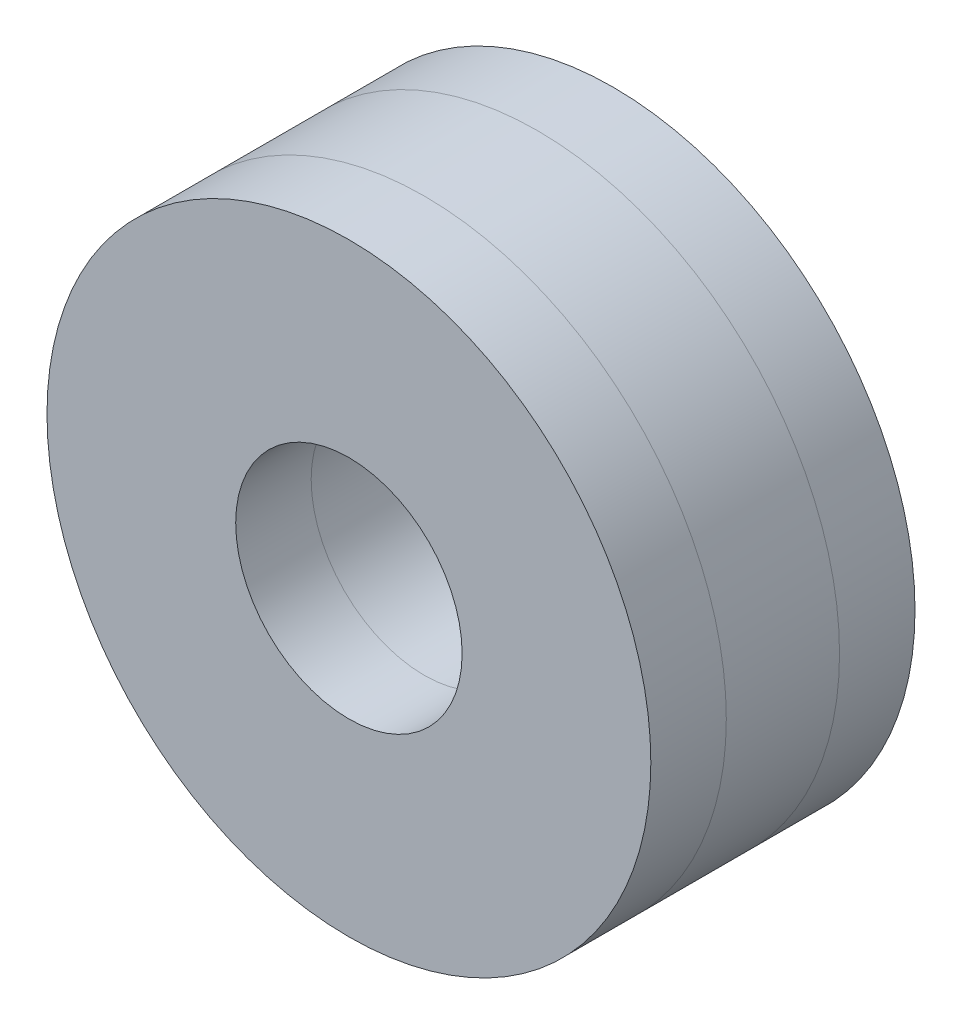
ISO-10303-21;
HEADER;
FILE_DESCRIPTION(('STEP AP214'),'2;1');
FILE_NAME('part.step','',(''),(''),'','','');
FILE_SCHEMA(('AUTOMOTIVE_DESIGN { 1 0 10303 214 1 1 1 1 }'));
ENDSEC;
DATA;
#1=APPLICATION_CONTEXT('core data for automotive mechanical design processes');
#2=APPLICATION_PROTOCOL_DEFINITION('international standard','automotive_design',2000,#1);
#3=PRODUCT_CONTEXT('',#1,'mechanical');
#4=PRODUCT('Part','Part','',(#3));
#5=PRODUCT_RELATED_PRODUCT_CATEGORY('part','',(#4));
#6=PRODUCT_DEFINITION_FORMATION('','',#4);
#7=PRODUCT_DEFINITION_CONTEXT('part definition',#1,'design');
#8=PRODUCT_DEFINITION('design','',#6,#7);
#9=PRODUCT_DEFINITION_SHAPE('','',#8);
#10=(LENGTH_UNIT() NAMED_UNIT(*) SI_UNIT(.MILLI.,.METRE.));
#11=(NAMED_UNIT(*) PLANE_ANGLE_UNIT() SI_UNIT($,.RADIAN.));
#12=(NAMED_UNIT(*) SI_UNIT($,.STERADIAN.) SOLID_ANGLE_UNIT());
#13=UNCERTAINTY_MEASURE_WITH_UNIT(LENGTH_MEASURE(1.E-05),#10,'distance_accuracy_value','');
#14=(GEOMETRIC_REPRESENTATION_CONTEXT(3) GLOBAL_UNCERTAINTY_ASSIGNED_CONTEXT((#13)) GLOBAL_UNIT_ASSIGNED_CONTEXT((#10,
#11,#12)) REPRESENTATION_CONTEXT('',''));
#15=CARTESIAN_POINT('',(0.,0.,0.));
#16=DIRECTION('',(0.,0.,1.));
#17=DIRECTION('',(1.,0.,0.));
#18=AXIS2_PLACEMENT_3D('',#15,#16,#17);
#19=CARTESIAN_POINT('',(0.,0.,3.5));
#20=DIRECTION('',(0.,0.,1.));
#21=DIRECTION('',(1.,0.,0.));
#22=AXIS2_PLACEMENT_3D('',#19,#20,#21);
#23=PLANE('',#22);
#24=CARTESIAN_POINT('',(0.,0.,3.5));
#25=DIRECTION('',(0.,0.,1.));
#26=DIRECTION('',(1.,0.,0.));
#27=AXIS2_PLACEMENT_3D('',#24,#25,#26);
#28=CIRCLE('',#27,4.);
#29=CARTESIAN_POINT('',(4.,0.,3.5));
#30=VERTEX_POINT('',#29);
#31=EDGE_CURVE('E11',#30,#30,#28,.T.);
#32=ORIENTED_EDGE('',*,*,#31,.T.);
#33=EDGE_LOOP('',(#32));
#34=FACE_BOUND('',#33,.T.);
#35=CARTESIAN_POINT('',(0.,0.,3.5));
#36=DIRECTION('',(0.,0.,1.));
#37=DIRECTION('',(1.,0.,0.));
#38=AXIS2_PLACEMENT_3D('',#35,#36,#37);
#39=CIRCLE('',#38,1.5);
#40=CARTESIAN_POINT('',(1.5,0.,3.5));
#41=VERTEX_POINT('',#40);
#42=EDGE_CURVE('E57',#41,#41,#39,.T.);
#43=ORIENTED_EDGE('',*,*,#42,.F.);
#44=EDGE_LOOP('',(#43));
#45=FACE_BOUND('',#44,.T.);
#46=ADVANCED_FACE('F46',(#34,#45),#23,.T.);
#47=CARTESIAN_POINT('',(0.,0.,2.5));
#48=DIRECTION('',(0.,0.,1.));
#49=DIRECTION('',(1.,0.,0.));
#50=AXIS2_PLACEMENT_3D('',#47,#48,#49);
#51=PLANE('',#50);
#52=CARTESIAN_POINT('',(0.,0.,2.5));
#53=DIRECTION('',(0.,0.,1.));
#54=DIRECTION('',(1.,0.,0.));
#55=AXIS2_PLACEMENT_3D('',#52,#53,#54);
#56=CIRCLE('',#55,4.);
#57=CARTESIAN_POINT('',(4.,0.,2.5));
#58=VERTEX_POINT('',#57);
#59=EDGE_CURVE('E50',#58,#58,#56,.T.);
#60=ORIENTED_EDGE('',*,*,#59,.F.);
#61=EDGE_LOOP('',(#60));
#62=FACE_BOUND('',#61,.T.);
#63=CARTESIAN_POINT('',(0.,0.,2.5));
#64=DIRECTION('',(0.,0.,1.));
#65=DIRECTION('',(1.,0.,0.));
#66=AXIS2_PLACEMENT_3D('',#63,#64,#65);
#67=CIRCLE('',#66,1.5);
#68=CARTESIAN_POINT('',(1.5,0.,2.5));
#69=VERTEX_POINT('',#68);
#70=EDGE_CURVE('E59',#69,#69,#67,.T.);
#71=ORIENTED_EDGE('',*,*,#70,.T.);
#72=EDGE_LOOP('',(#71));
#73=FACE_BOUND('',#72,.T.);
#74=ADVANCED_FACE('F69',(#62,#73),#51,.F.);
#75=CARTESIAN_POINT('',(0.,0.,3.5));
#76=DIRECTION('',(0.,0.,-1.));
#77=DIRECTION('',(-1.,0.,0.));
#78=AXIS2_PLACEMENT_3D('',#75,#76,#77);
#79=CYLINDRICAL_SURFACE('',#78,4.);
#80=ORIENTED_EDGE('',*,*,#31,.F.);
#81=EDGE_LOOP('',(#80));
#82=FACE_BOUND('',#81,.T.);
#83=ORIENTED_EDGE('',*,*,#59,.T.);
#84=EDGE_LOOP('',(#83));
#85=FACE_BOUND('',#84,.T.);
#86=ADVANCED_FACE('F48',(#82,#85),#79,.T.);
#87=CARTESIAN_POINT('',(0.,0.,3.5));
#88=DIRECTION('',(0.,0.,-1.));
#89=DIRECTION('',(-1.,0.,0.));
#90=AXIS2_PLACEMENT_3D('',#87,#88,#89);
#91=CYLINDRICAL_SURFACE('',#90,1.5);
#92=ORIENTED_EDGE('',*,*,#42,.T.);
#93=EDGE_LOOP('',(#92));
#94=FACE_BOUND('',#93,.T.);
#95=ORIENTED_EDGE('',*,*,#70,.F.);
#96=EDGE_LOOP('',(#95));
#97=FACE_BOUND('',#96,.T.);
#98=ADVANCED_FACE('F65',(#94,#97),#91,.F.);
#99=CLOSED_SHELL('',(#46,#74,#86,#98));
#100=MANIFOLD_SOLID_BREP('B2',#99);
#101=CARTESIAN_POINT('',(0.,0.,2.5));
#102=DIRECTION('',(0.,0.,1.));
#103=DIRECTION('',(1.,0.,0.));
#104=AXIS2_PLACEMENT_3D('',#101,#102,#103);
#105=PLANE('',#104);
#106=CARTESIAN_POINT('',(0.,0.,2.5));
#107=DIRECTION('',(0.,0.,1.));
#108=DIRECTION('',(1.,0.,0.));
#109=AXIS2_PLACEMENT_3D('',#106,#107,#108);
#110=CIRCLE('',#109,4.);
#111=CARTESIAN_POINT('',(4.,0.,2.5));
#112=VERTEX_POINT('',#111);
#113=EDGE_CURVE('E45',#112,#112,#110,.T.);
#114=ORIENTED_EDGE('',*,*,#113,.T.);
#115=EDGE_LOOP('',(#114));
#116=FACE_BOUND('',#115,.T.);
#117=CARTESIAN_POINT('',(0.,0.,2.5));
#118=DIRECTION('',(0.,0.,1.));
#119=DIRECTION('',(1.,0.,0.));
#120=AXIS2_PLACEMENT_3D('',#117,#118,#119);
#121=CIRCLE('',#120,1.5);
#122=CARTESIAN_POINT('',(1.5,0.,2.5));
#123=VERTEX_POINT('',#122);
#124=EDGE_CURVE('E128',#123,#123,#121,.T.);
#125=ORIENTED_EDGE('',*,*,#124,.F.);
#126=EDGE_LOOP('',(#125));
#127=FACE_BOUND('',#126,.T.);
#128=ADVANCED_FACE('F115',(#116,#127),#105,.T.);
#129=CARTESIAN_POINT('',(0.,0.,1.));
#130=DIRECTION('',(0.,0.,1.));
#131=DIRECTION('',(1.,0.,0.));
#132=AXIS2_PLACEMENT_3D('',#129,#130,#131);
#133=PLANE('',#132);
#134=CARTESIAN_POINT('',(0.,0.,1.));
#135=DIRECTION('',(0.,0.,1.));
#136=DIRECTION('',(1.,0.,0.));
#137=AXIS2_PLACEMENT_3D('',#134,#135,#136);
#138=CIRCLE('',#137,4.);
#139=CARTESIAN_POINT('',(4.,0.,1.));
#140=VERTEX_POINT('',#139);
#141=EDGE_CURVE('E119',#140,#140,#138,.T.);
#142=ORIENTED_EDGE('',*,*,#141,.F.);
#143=EDGE_LOOP('',(#142));
#144=FACE_BOUND('',#143,.T.);
#145=CARTESIAN_POINT('',(0.,0.,1.));
#146=DIRECTION('',(0.,0.,1.));
#147=DIRECTION('',(1.,0.,0.));
#148=AXIS2_PLACEMENT_3D('',#145,#146,#147);
#149=CIRCLE('',#148,1.5);
#150=CARTESIAN_POINT('',(1.5,0.,1.));
#151=VERTEX_POINT('',#150);
#152=EDGE_CURVE('E130',#151,#151,#149,.T.);
#153=ORIENTED_EDGE('',*,*,#152,.T.);
#154=EDGE_LOOP('',(#153));
#155=FACE_BOUND('',#154,.T.);
#156=ADVANCED_FACE('F142',(#144,#155),#133,.F.);
#157=CARTESIAN_POINT('',(0.,0.,2.5));
#158=DIRECTION('',(0.,0.,-1.));
#159=DIRECTION('',(-1.,0.,0.));
#160=AXIS2_PLACEMENT_3D('',#157,#158,#159);
#161=CYLINDRICAL_SURFACE('',#160,4.);
#162=ORIENTED_EDGE('',*,*,#113,.F.);
#163=EDGE_LOOP('',(#162));
#164=FACE_BOUND('',#163,.T.);
#165=ORIENTED_EDGE('',*,*,#141,.T.);
#166=EDGE_LOOP('',(#165));
#167=FACE_BOUND('',#166,.T.);
#168=ADVANCED_FACE('F117',(#164,#167),#161,.T.);
#169=CARTESIAN_POINT('',(0.,0.,2.5));
#170=DIRECTION('',(0.,0.,-1.));
#171=DIRECTION('',(-1.,0.,0.));
#172=AXIS2_PLACEMENT_3D('',#169,#170,#171);
#173=CYLINDRICAL_SURFACE('',#172,1.5);
#174=ORIENTED_EDGE('',*,*,#124,.T.);
#175=EDGE_LOOP('',(#174));
#176=FACE_BOUND('',#175,.T.);
#177=ORIENTED_EDGE('',*,*,#152,.F.);
#178=EDGE_LOOP('',(#177));
#179=FACE_BOUND('',#178,.T.);
#180=ADVANCED_FACE('F138',(#176,#179),#173,.F.);
#181=CLOSED_SHELL('',(#128,#156,#168,#180));
#182=MANIFOLD_SOLID_BREP('B6',#181);
#183=CARTESIAN_POINT('',(0.,0.,1.));
#184=DIRECTION('',(0.,0.,1.));
#185=DIRECTION('',(1.,0.,0.));
#186=AXIS2_PLACEMENT_3D('',#183,#184,#185);
#187=PLANE('',#186);
#188=CARTESIAN_POINT('',(0.,0.,1.));
#189=DIRECTION('',(0.,0.,1.));
#190=DIRECTION('',(1.,0.,0.));
#191=AXIS2_PLACEMENT_3D('',#188,#189,#190);
#192=CIRCLE('',#191,4.);
#193=CARTESIAN_POINT('',(4.,0.,1.));
#194=VERTEX_POINT('',#193);
#195=EDGE_CURVE('E114',#194,#194,#192,.T.);
#196=ORIENTED_EDGE('',*,*,#195,.T.);
#197=EDGE_LOOP('',(#196));
#198=FACE_BOUND('',#197,.T.);
#199=CARTESIAN_POINT('',(0.,0.,1.));
#200=DIRECTION('',(0.,0.,1.));
#201=DIRECTION('',(1.,0.,0.));
#202=AXIS2_PLACEMENT_3D('',#199,#200,#201);
#203=CIRCLE('',#202,1.5);
#204=CARTESIAN_POINT('',(1.5,0.,1.));
#205=VERTEX_POINT('',#204);
#206=EDGE_CURVE('E192',#205,#205,#203,.T.);
#207=ORIENTED_EDGE('',*,*,#206,.F.);
#208=EDGE_LOOP('',(#207));
#209=FACE_BOUND('',#208,.T.);
#210=ADVANCED_FACE('F181',(#198,#209),#187,.T.);
#211=CARTESIAN_POINT('',(0.,0.,0.));
#212=DIRECTION('',(0.,0.,1.));
#213=DIRECTION('',(1.,0.,0.));
#214=AXIS2_PLACEMENT_3D('',#211,#212,#213);
#215=PLANE('',#214);
#216=CARTESIAN_POINT('',(0.,0.,0.));
#217=DIRECTION('',(0.,0.,1.));
#218=DIRECTION('',(1.,0.,0.));
#219=AXIS2_PLACEMENT_3D('',#216,#217,#218);
#220=CIRCLE('',#219,4.);
#221=CARTESIAN_POINT('',(4.,0.,0.));
#222=VERTEX_POINT('',#221);
#223=EDGE_CURVE('E185',#222,#222,#220,.T.);
#224=ORIENTED_EDGE('',*,*,#223,.F.);
#225=EDGE_LOOP('',(#224));
#226=FACE_BOUND('',#225,.T.);
#227=CARTESIAN_POINT('',(0.,0.,0.));
#228=DIRECTION('',(0.,0.,1.));
#229=DIRECTION('',(1.,0.,0.));
#230=AXIS2_PLACEMENT_3D('',#227,#228,#229);
#231=CIRCLE('',#230,1.5);
#232=CARTESIAN_POINT('',(1.5,0.,0.));
#233=VERTEX_POINT('',#232);
#234=EDGE_CURVE('E194',#233,#233,#231,.T.);
#235=ORIENTED_EDGE('',*,*,#234,.T.);
#236=EDGE_LOOP('',(#235));
#237=FACE_BOUND('',#236,.T.);
#238=ADVANCED_FACE('F204',(#226,#237),#215,.F.);
#239=CARTESIAN_POINT('',(0.,0.,1.));
#240=DIRECTION('',(0.,0.,-1.));
#241=DIRECTION('',(-1.,0.,0.));
#242=AXIS2_PLACEMENT_3D('',#239,#240,#241);
#243=CYLINDRICAL_SURFACE('',#242,4.);
#244=ORIENTED_EDGE('',*,*,#195,.F.);
#245=EDGE_LOOP('',(#244));
#246=FACE_BOUND('',#245,.T.);
#247=ORIENTED_EDGE('',*,*,#223,.T.);
#248=EDGE_LOOP('',(#247));
#249=FACE_BOUND('',#248,.T.);
#250=ADVANCED_FACE('F183',(#246,#249),#243,.T.);
#251=CARTESIAN_POINT('',(0.,0.,1.));
#252=DIRECTION('',(0.,0.,-1.));
#253=DIRECTION('',(-1.,0.,0.));
#254=AXIS2_PLACEMENT_3D('',#251,#252,#253);
#255=CYLINDRICAL_SURFACE('',#254,1.5);
#256=ORIENTED_EDGE('',*,*,#206,.T.);
#257=EDGE_LOOP('',(#256));
#258=FACE_BOUND('',#257,.T.);
#259=ORIENTED_EDGE('',*,*,#234,.F.);
#260=EDGE_LOOP('',(#259));
#261=FACE_BOUND('',#260,.T.);
#262=ADVANCED_FACE('F200',(#258,#261),#255,.F.);
#263=CLOSED_SHELL('',(#210,#238,#250,#262));
#264=MANIFOLD_SOLID_BREP('B40',#263);
#265=ADVANCED_BREP_SHAPE_REPRESENTATION('',(#18,#100,#182,#264),#14);
#266=SHAPE_DEFINITION_REPRESENTATION(#9,#265);
ENDSEC;
END-ISO-10303-21;
